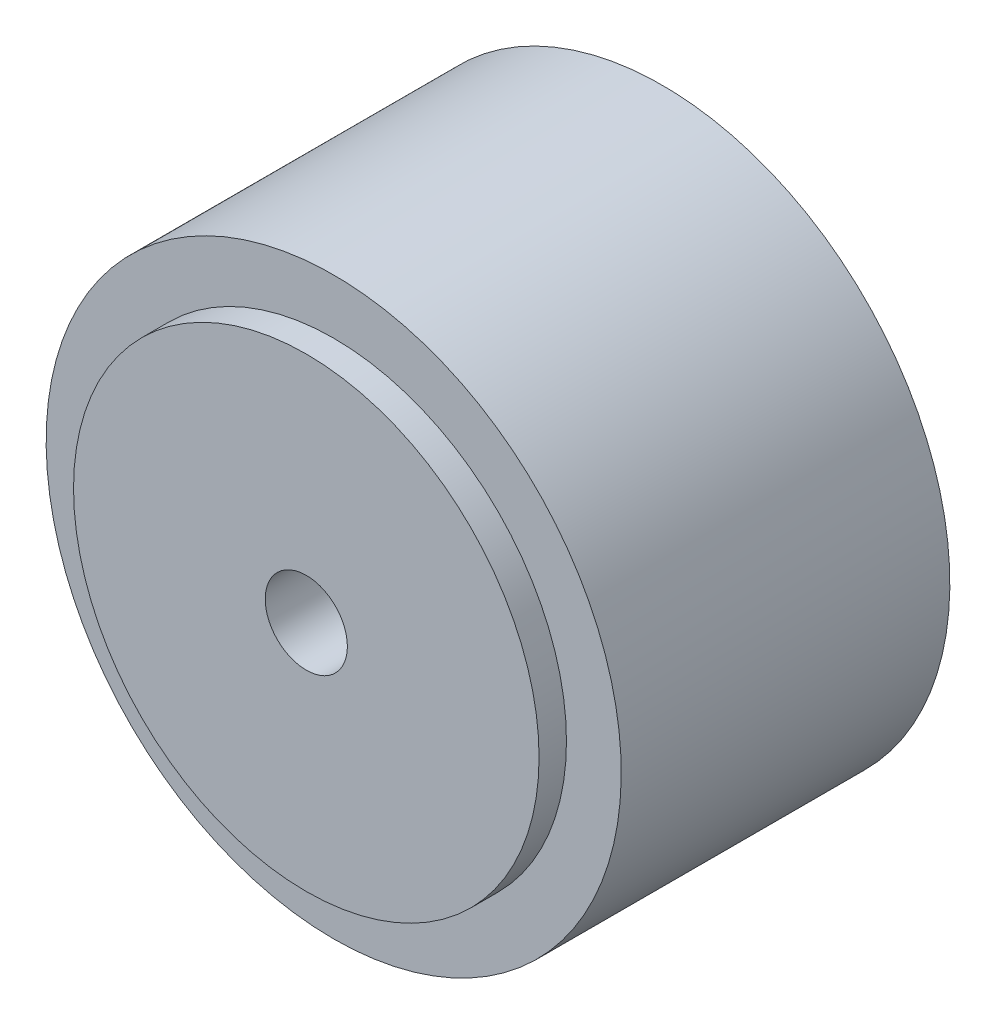
ISO-10303-21;
HEADER;
FILE_DESCRIPTION(('STEP AP214'),'2;1');
FILE_NAME('part.step','',(''),(''),'','','');
FILE_SCHEMA(('AUTOMOTIVE_DESIGN { 1 0 10303 214 1 1 1 1 }'));
ENDSEC;
DATA;
#1=APPLICATION_CONTEXT('core data for automotive mechanical design processes');
#2=APPLICATION_PROTOCOL_DEFINITION('international standard','automotive_design',2000,#1);
#3=PRODUCT_CONTEXT('',#1,'mechanical');
#4=PRODUCT('Part','Part','',(#3));
#5=PRODUCT_RELATED_PRODUCT_CATEGORY('part','',(#4));
#6=PRODUCT_DEFINITION_FORMATION('','',#4);
#7=PRODUCT_DEFINITION_CONTEXT('part definition',#1,'design');
#8=PRODUCT_DEFINITION('design','',#6,#7);
#9=PRODUCT_DEFINITION_SHAPE('','',#8);
#10=(LENGTH_UNIT() NAMED_UNIT(*) SI_UNIT(.MILLI.,.METRE.));
#11=(NAMED_UNIT(*) PLANE_ANGLE_UNIT() SI_UNIT($,.RADIAN.));
#12=(NAMED_UNIT(*) SI_UNIT($,.STERADIAN.) SOLID_ANGLE_UNIT());
#13=UNCERTAINTY_MEASURE_WITH_UNIT(LENGTH_MEASURE(1.E-05),#10,'distance_accuracy_value','');
#14=(GEOMETRIC_REPRESENTATION_CONTEXT(3) GLOBAL_UNCERTAINTY_ASSIGNED_CONTEXT((#13)) GLOBAL_UNIT_ASSIGNED_CONTEXT((#10,
#11,#12)) REPRESENTATION_CONTEXT('',''));
#15=CARTESIAN_POINT('',(0.,0.,0.));
#16=DIRECTION('',(0.,0.,1.));
#17=DIRECTION('',(1.,0.,0.));
#18=AXIS2_PLACEMENT_3D('',#15,#16,#17);
#19=CARTESIAN_POINT('',(0.,0.,0.));
#20=DIRECTION('',(0.,0.,-1.));
#21=DIRECTION('',(0.,1.,0.));
#22=AXIS2_PLACEMENT_3D('',#19,#20,#21);
#23=PLANE('',#22);
#24=CARTESIAN_POINT('',(0.,0.,0.));
#25=DIRECTION('',(0.,0.,1.));
#26=DIRECTION('',(0.,-1.,0.));
#27=AXIS2_PLACEMENT_3D('',#24,#25,#26);
#28=CIRCLE('',#27,8.5);
#29=CARTESIAN_POINT('',(0.,-8.49999999999999,0.));
#30=VERTEX_POINT('',#29);
#31=EDGE_CURVE('E54',#30,#30,#28,.T.);
#32=ORIENTED_EDGE('',*,*,#31,.T.);
#33=EDGE_LOOP('',(#32));
#34=FACE_BOUND('',#33,.T.);
#35=CARTESIAN_POINT('',(0.,0.,0.));
#36=DIRECTION('',(0.,0.,1.));
#37=DIRECTION('',(1.,0.,0.));
#38=AXIS2_PLACEMENT_3D('',#35,#36,#37);
#39=CIRCLE('',#38,1.5);
#40=CARTESIAN_POINT('',(1.5,0.,0.));
#41=VERTEX_POINT('',#40);
#42=EDGE_CURVE('E89',#41,#41,#39,.T.);
#43=ORIENTED_EDGE('',*,*,#42,.F.);
#44=EDGE_LOOP('',(#43));
#45=FACE_BOUND('',#44,.T.);
#46=ADVANCED_FACE('F40',(#34,#45),#23,.F.);
#47=CARTESIAN_POINT('',(0.,0.,21.2190542420028));
#48=DIRECTION('',(0.,0.,1.));
#49=DIRECTION('',(0.,-1.,0.));
#50=AXIS2_PLACEMENT_3D('',#47,#48,#49);
#51=CYLINDRICAL_SURFACE('',#50,8.5);
#52=ORIENTED_EDGE('',*,*,#31,.F.);
#53=EDGE_LOOP('',(#52));
#54=FACE_BOUND('',#53,.T.);
#55=CARTESIAN_POINT('',(0.,0.,-1.));
#56=DIRECTION('',(0.,0.,1.));
#57=DIRECTION('',(0.,-1.,0.));
#58=AXIS2_PLACEMENT_3D('',#55,#56,#57);
#59=CIRCLE('',#58,8.5);
#60=CARTESIAN_POINT('',(0.,-8.49999999999999,-1.));
#61=VERTEX_POINT('',#60);
#62=EDGE_CURVE('E59',#61,#61,#59,.T.);
#63=ORIENTED_EDGE('',*,*,#62,.T.);
#64=EDGE_LOOP('',(#63));
#65=FACE_BOUND('',#64,.T.);
#66=ADVANCED_FACE('F97',(#54,#65),#51,.T.);
#67=CARTESIAN_POINT('',(0.,8.5,-1.));
#68=DIRECTION('',(0.,0.,-1.));
#69=DIRECTION('',(0.,1.,0.));
#70=AXIS2_PLACEMENT_3D('',#67,#68,#69);
#71=PLANE('',#70);
#72=ORIENTED_EDGE('',*,*,#62,.F.);
#73=EDGE_LOOP('',(#72));
#74=FACE_BOUND('',#73,.T.);
#75=CARTESIAN_POINT('',(0.,0.,-1.));
#76=DIRECTION('',(0.,0.,1.));
#77=DIRECTION('',(0.,-1.,0.));
#78=AXIS2_PLACEMENT_3D('',#75,#76,#77);
#79=CIRCLE('',#78,10.5);
#80=CARTESIAN_POINT('',(0.,-10.5,-1.00000000000001));
#81=VERTEX_POINT('',#80);
#82=EDGE_CURVE('E65',#81,#81,#79,.T.);
#83=ORIENTED_EDGE('',*,*,#82,.T.);
#84=EDGE_LOOP('',(#83));
#85=FACE_BOUND('',#84,.T.);
#86=ADVANCED_FACE('F102',(#74,#85),#71,.F.);
#87=CARTESIAN_POINT('',(0.,0.,21.2190542420028));
#88=DIRECTION('',(0.,0.,1.));
#89=DIRECTION('',(0.,-1.,0.));
#90=AXIS2_PLACEMENT_3D('',#87,#88,#89);
#91=CYLINDRICAL_SURFACE('',#90,10.5);
#92=ORIENTED_EDGE('',*,*,#82,.F.);
#93=EDGE_LOOP('',(#92));
#94=FACE_BOUND('',#93,.T.);
#95=CARTESIAN_POINT('',(0.,0.,-13.));
#96=DIRECTION('',(0.,0.,1.));
#97=DIRECTION('',(0.,-1.,0.));
#98=AXIS2_PLACEMENT_3D('',#95,#96,#97);
#99=CIRCLE('',#98,10.5);
#100=CARTESIAN_POINT('',(0.,-10.5,-13.));
#101=VERTEX_POINT('',#100);
#102=EDGE_CURVE('E69',#101,#101,#99,.T.);
#103=ORIENTED_EDGE('',*,*,#102,.T.);
#104=EDGE_LOOP('',(#103));
#105=FACE_BOUND('',#104,.T.);
#106=ADVANCED_FACE('F108',(#94,#105),#91,.T.);
#107=CARTESIAN_POINT('',(0.,10.5,-13.));
#108=DIRECTION('',(0.,0.,1.));
#109=DIRECTION('',(0.,-1.,0.));
#110=AXIS2_PLACEMENT_3D('',#107,#108,#109);
#111=PLANE('',#110);
#112=ORIENTED_EDGE('',*,*,#102,.F.);
#113=EDGE_LOOP('',(#112));
#114=FACE_BOUND('',#113,.T.);
#115=CARTESIAN_POINT('',(0.,0.,-13.));
#116=DIRECTION('',(0.,0.,1.));
#117=DIRECTION('',(0.,-1.,0.));
#118=AXIS2_PLACEMENT_3D('',#115,#116,#117);
#119=CIRCLE('',#118,8.49999999999999);
#120=CARTESIAN_POINT('',(0.,-8.49999999999999,-13.));
#121=VERTEX_POINT('',#120);
#122=EDGE_CURVE('E73',#121,#121,#119,.T.);
#123=ORIENTED_EDGE('',*,*,#122,.T.);
#124=EDGE_LOOP('',(#123));
#125=FACE_BOUND('',#124,.T.);
#126=ADVANCED_FACE('F112',(#114,#125),#111,.F.);
#127=CARTESIAN_POINT('',(0.,0.,21.2190542420028));
#128=DIRECTION('',(0.,0.,1.));
#129=DIRECTION('',(0.,-1.,0.));
#130=AXIS2_PLACEMENT_3D('',#127,#128,#129);
#131=CYLINDRICAL_SURFACE('',#130,8.49999999999999);
#132=ORIENTED_EDGE('',*,*,#122,.F.);
#133=EDGE_LOOP('',(#132));
#134=FACE_BOUND('',#133,.T.);
#135=CARTESIAN_POINT('',(0.,0.,-14.));
#136=DIRECTION('',(0.,0.,1.));
#137=DIRECTION('',(0.,-1.,0.));
#138=AXIS2_PLACEMENT_3D('',#135,#136,#137);
#139=CIRCLE('',#138,8.49999999999999);
#140=CARTESIAN_POINT('',(0.,-8.49999999999999,-14.));
#141=VERTEX_POINT('',#140);
#142=EDGE_CURVE('E77',#141,#141,#139,.T.);
#143=ORIENTED_EDGE('',*,*,#142,.T.);
#144=EDGE_LOOP('',(#143));
#145=FACE_BOUND('',#144,.T.);
#146=ADVANCED_FACE('F116',(#134,#145),#131,.T.);
#147=CARTESIAN_POINT('',(0.,8.5,-14.));
#148=DIRECTION('',(0.,0.,1.));
#149=DIRECTION('',(0.,-1.,0.));
#150=AXIS2_PLACEMENT_3D('',#147,#148,#149);
#151=PLANE('',#150);
#152=CARTESIAN_POINT('',(0.,0.,-14.));
#153=DIRECTION('',(0.,0.,1.));
#154=DIRECTION('',(0.,-1.,0.));
#155=AXIS2_PLACEMENT_3D('',#152,#153,#154);
#156=CIRCLE('',#155,6.5);
#157=CARTESIAN_POINT('',(0.,-6.49999999999999,-14.));
#158=VERTEX_POINT('',#157);
#159=EDGE_CURVE('E49',#158,#158,#156,.T.);
#160=ORIENTED_EDGE('',*,*,#159,.T.);
#161=EDGE_LOOP('',(#160));
#162=FACE_BOUND('',#161,.T.);
#163=ORIENTED_EDGE('',*,*,#142,.F.);
#164=EDGE_LOOP('',(#163));
#165=FACE_BOUND('',#164,.T.);
#166=ADVANCED_FACE('F120',(#162,#165),#151,.F.);
#167=CARTESIAN_POINT('',(0.,0.,21.2190542420028));
#168=DIRECTION('',(0.,0.,1.));
#169=DIRECTION('',(0.,-1.,0.));
#170=AXIS2_PLACEMENT_3D('',#167,#168,#169);
#171=CYLINDRICAL_SURFACE('',#170,5.49999999999999);
#172=CARTESIAN_POINT('',(0.,0.,-13.));
#173=DIRECTION('',(0.,0.,1.));
#174=DIRECTION('',(0.,-1.,0.));
#175=AXIS2_PLACEMENT_3D('',#172,#173,#174);
#176=CIRCLE('',#175,5.49999999999999);
#177=CARTESIAN_POINT('',(0.,-5.49999999999999,-13.));
#178=VERTEX_POINT('',#177);
#179=EDGE_CURVE('E10',#178,#178,#176,.F.);
#180=ORIENTED_EDGE('',*,*,#179,.T.);
#181=EDGE_LOOP('',(#180));
#182=FACE_BOUND('',#181,.T.);
#183=CARTESIAN_POINT('',(0.,0.,-3.));
#184=DIRECTION('',(0.,0.,1.));
#185=DIRECTION('',(0.,-1.,0.));
#186=AXIS2_PLACEMENT_3D('',#183,#184,#185);
#187=CIRCLE('',#186,5.49999999999999);
#188=CARTESIAN_POINT('',(0.,-5.49999999999999,-3.));
#189=VERTEX_POINT('',#188);
#190=EDGE_CURVE('E81',#189,#189,#187,.T.);
#191=ORIENTED_EDGE('',*,*,#190,.T.);
#192=EDGE_LOOP('',(#191));
#193=FACE_BOUND('',#192,.T.);
#194=ADVANCED_FACE('F124',(#182,#193),#171,.F.);
#195=CARTESIAN_POINT('',(0.,5.5,-3.));
#196=DIRECTION('',(0.,0.,1.));
#197=DIRECTION('',(0.,-1.,0.));
#198=AXIS2_PLACEMENT_3D('',#195,#196,#197);
#199=PLANE('',#198);
#200=CARTESIAN_POINT('',(0.,0.,-3.));
#201=DIRECTION('',(0.,0.,1.));
#202=DIRECTION('',(0.,-1.,0.));
#203=AXIS2_PLACEMENT_3D('',#200,#201,#202);
#204=CIRCLE('',#203,1.5);
#205=CARTESIAN_POINT('',(0.,-1.5,-3.));
#206=VERTEX_POINT('',#205);
#207=EDGE_CURVE('E85',#206,#206,#204,.T.);
#208=ORIENTED_EDGE('',*,*,#207,.T.);
#209=EDGE_LOOP('',(#208));
#210=FACE_BOUND('',#209,.T.);
#211=ORIENTED_EDGE('',*,*,#190,.F.);
#212=EDGE_LOOP('',(#211));
#213=FACE_BOUND('',#212,.T.);
#214=ADVANCED_FACE('F127',(#210,#213),#199,.F.);
#215=CARTESIAN_POINT('',(0.,0.,0.));
#216=DIRECTION('',(0.,0.,1.));
#217=DIRECTION('',(1.,0.,0.));
#218=AXIS2_PLACEMENT_3D('',#215,#216,#217);
#219=CYLINDRICAL_SURFACE('',#218,1.5);
#220=ORIENTED_EDGE('',*,*,#207,.F.);
#221=EDGE_LOOP('',(#220));
#222=FACE_BOUND('',#221,.T.);
#223=ORIENTED_EDGE('',*,*,#42,.T.);
#224=EDGE_LOOP('',(#223));
#225=FACE_BOUND('',#224,.T.);
#226=ADVANCED_FACE('F94',(#222,#225),#219,.F.);
#227=CARTESIAN_POINT('',(0.,0.,-14.));
#228=DIRECTION('',(0.,0.,-1.));
#229=DIRECTION('',(0.,1.,0.));
#230=AXIS2_PLACEMENT_3D('',#227,#228,#229);
#231=CONICAL_SURFACE('',#230,6.5,0.785398163397446);
#232=ORIENTED_EDGE('',*,*,#179,.F.);
#233=EDGE_LOOP('',(#232));
#234=FACE_BOUND('',#233,.T.);
#235=ORIENTED_EDGE('',*,*,#159,.F.);
#236=EDGE_LOOP('',(#235));
#237=FACE_BOUND('',#236,.T.);
#238=ADVANCED_FACE('F43',(#234,#237),#231,.F.);
#239=CLOSED_SHELL('',(#46,#66,#86,#106,#126,#146,#166,#194,#214,#226,#238));
#240=MANIFOLD_SOLID_BREP('B2',#239);
#241=ADVANCED_BREP_SHAPE_REPRESENTATION('',(#18,#240),#14);
#242=SHAPE_DEFINITION_REPRESENTATION(#9,#241);
ENDSEC;
END-ISO-10303-21;
